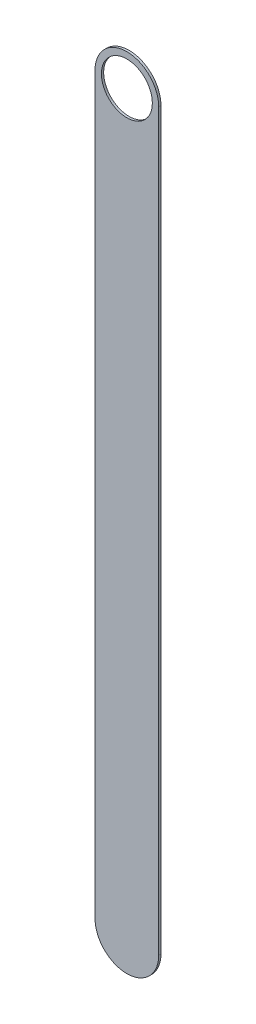
ISO-10303-21;
HEADER;
FILE_DESCRIPTION(('STEP AP214'),'2;1');
FILE_NAME('part.step','',(''),(''),'','','');
FILE_SCHEMA(('AUTOMOTIVE_DESIGN { 1 0 10303 214 1 1 1 1 }'));
ENDSEC;
DATA;
#1=APPLICATION_CONTEXT('core data for automotive mechanical design processes');
#2=APPLICATION_PROTOCOL_DEFINITION('international standard','automotive_design',2000,#1);
#3=PRODUCT_CONTEXT('',#1,'mechanical');
#4=PRODUCT('Part','Part','',(#3));
#5=PRODUCT_RELATED_PRODUCT_CATEGORY('part','',(#4));
#6=PRODUCT_DEFINITION_FORMATION('','',#4);
#7=PRODUCT_DEFINITION_CONTEXT('part definition',#1,'design');
#8=PRODUCT_DEFINITION('design','',#6,#7);
#9=PRODUCT_DEFINITION_SHAPE('','',#8);
#10=(LENGTH_UNIT() NAMED_UNIT(*) SI_UNIT(.MILLI.,.METRE.));
#11=(NAMED_UNIT(*) PLANE_ANGLE_UNIT() SI_UNIT($,.RADIAN.));
#12=(NAMED_UNIT(*) SI_UNIT($,.STERADIAN.) SOLID_ANGLE_UNIT());
#13=UNCERTAINTY_MEASURE_WITH_UNIT(LENGTH_MEASURE(1.E-05),#10,'distance_accuracy_value','');
#14=(GEOMETRIC_REPRESENTATION_CONTEXT(3) GLOBAL_UNCERTAINTY_ASSIGNED_CONTEXT((#13)) GLOBAL_UNIT_ASSIGNED_CONTEXT((#10,
#11,#12)) REPRESENTATION_CONTEXT('',''));
#15=CARTESIAN_POINT('',(0.,0.,0.));
#16=DIRECTION('',(0.,0.,1.));
#17=DIRECTION('',(1.,0.,0.));
#18=AXIS2_PLACEMENT_3D('',#15,#16,#17);
#19=CARTESIAN_POINT('',(57.920001,51.0569972,0.));
#20=DIRECTION('',(-1.,0.,0.));
#21=DIRECTION('',(0.,1.,0.));
#22=AXIS2_PLACEMENT_3D('',#19,#20,#21);
#23=PLANE('',#22);
#24=DIRECTION('',(0.,1.,0.));
#25=VECTOR('',#24,1.);
#26=CARTESIAN_POINT('',(57.920001,51.0569972,0.03556));
#27=LINE('',#26,#25);
#28=CARTESIAN_POINT('',(57.920001,51.0569972,0.03556));
#29=VERTEX_POINT('',#28);
#30=CARTESIAN_POINT('',(57.920001,62.6000272,0.03556));
#31=VERTEX_POINT('',#30);
#32=EDGE_CURVE('E11',#29,#31,#27,.T.);
#33=ORIENTED_EDGE('',*,*,#32,.F.);
#34=DIRECTION('',(0.,0.,1.));
#35=VECTOR('',#34,1.);
#36=CARTESIAN_POINT('',(57.920001,51.0569972,0.));
#37=LINE('',#36,#35);
#38=CARTESIAN_POINT('',(57.920001,51.0569972,0.));
#39=VERTEX_POINT('',#38);
#40=EDGE_CURVE('E24',#39,#29,#37,.T.);
#41=ORIENTED_EDGE('',*,*,#40,.F.);
#42=DIRECTION('',(0.,1.,0.));
#43=VECTOR('',#42,1.);
#44=CARTESIAN_POINT('',(57.920001,51.0569972,0.));
#45=LINE('',#44,#43);
#46=CARTESIAN_POINT('',(57.920001,62.6000272,0.));
#47=VERTEX_POINT('',#46);
#48=EDGE_CURVE('E96',#39,#47,#45,.T.);
#49=ORIENTED_EDGE('',*,*,#48,.T.);
#50=DIRECTION('',(0.,0.,1.));
#51=VECTOR('',#50,1.);
#52=CARTESIAN_POINT('',(57.920001,62.6000272,0.));
#53=LINE('',#52,#51);
#54=EDGE_CURVE('E37',#47,#31,#53,.T.);
#55=ORIENTED_EDGE('',*,*,#54,.T.);
#56=EDGE_LOOP('',(#33,#41,#49,#55));
#57=FACE_BOUND('',#56,.T.);
#58=ADVANCED_FACE('F17',(#57),#23,.F.);
#59=CARTESIAN_POINT('',(57.420002,51.0569972,0.));
#60=DIRECTION('',(0.,0.,-1.));
#61=DIRECTION('',(-1.,0.,0.));
#62=AXIS2_PLACEMENT_3D('',#59,#60,#61);
#63=CYLINDRICAL_SURFACE('',#62,0.499998999999998);
#64=CARTESIAN_POINT('',(57.420002,51.0569972,0.03556));
#65=DIRECTION('',(0.,0.,1.));
#66=DIRECTION('',(-1.,0.,0.));
#67=AXIS2_PLACEMENT_3D('',#64,#65,#66);
#68=CIRCLE('',#67,0.499998999999998);
#69=CARTESIAN_POINT('',(56.920003,51.0569972,0.03556));
#70=VERTEX_POINT('',#69);
#71=EDGE_CURVE('E92',#70,#29,#68,.T.);
#72=ORIENTED_EDGE('',*,*,#71,.F.);
#73=DIRECTION('',(0.,0.,1.));
#74=VECTOR('',#73,1.);
#75=CARTESIAN_POINT('',(56.920003,51.0569972,0.));
#76=LINE('',#75,#74);
#77=CARTESIAN_POINT('',(56.920003,51.0569972,0.));
#78=VERTEX_POINT('',#77);
#79=EDGE_CURVE('E90',#78,#70,#76,.T.);
#80=ORIENTED_EDGE('',*,*,#79,.F.);
#81=CARTESIAN_POINT('',(57.420002,51.0569972,0.));
#82=DIRECTION('',(0.,0.,1.));
#83=DIRECTION('',(-1.,0.,0.));
#84=AXIS2_PLACEMENT_3D('',#81,#82,#83);
#85=CIRCLE('',#84,0.499998999999998);
#86=EDGE_CURVE('E88',#78,#39,#85,.T.);
#87=ORIENTED_EDGE('',*,*,#86,.T.);
#88=ORIENTED_EDGE('',*,*,#40,.T.);
#89=EDGE_LOOP('',(#72,#80,#87,#88));
#90=FACE_BOUND('',#89,.T.);
#91=ADVANCED_FACE('F111',(#90),#63,.T.);
#92=CARTESIAN_POINT('',(57.420002,62.6000272,0.));
#93=DIRECTION('',(0.,0.,-1.));
#94=DIRECTION('',(1.,0.,0.));
#95=AXIS2_PLACEMENT_3D('',#92,#93,#94);
#96=CYLINDRICAL_SURFACE('',#95,0.499998999999998);
#97=CARTESIAN_POINT('',(57.420002,62.6000272,0.03556));
#98=DIRECTION('',(0.,0.,1.));
#99=DIRECTION('',(1.,0.,0.));
#100=AXIS2_PLACEMENT_3D('',#97,#98,#99);
#101=CIRCLE('',#100,0.499998999999998);
#102=CARTESIAN_POINT('',(56.920003,62.6000272,0.03556));
#103=VERTEX_POINT('',#102);
#104=EDGE_CURVE('E85',#31,#103,#101,.T.);
#105=ORIENTED_EDGE('',*,*,#104,.F.);
#106=ORIENTED_EDGE('',*,*,#54,.F.);
#107=CARTESIAN_POINT('',(57.420002,62.6000272,0.));
#108=DIRECTION('',(0.,0.,1.));
#109=DIRECTION('',(1.,0.,0.));
#110=AXIS2_PLACEMENT_3D('',#107,#108,#109);
#111=CIRCLE('',#110,0.499998999999998);
#112=CARTESIAN_POINT('',(56.920003,62.6000272,0.));
#113=VERTEX_POINT('',#112);
#114=EDGE_CURVE('E82',#47,#113,#111,.T.);
#115=ORIENTED_EDGE('',*,*,#114,.T.);
#116=DIRECTION('',(0.,0.,1.));
#117=VECTOR('',#116,1.);
#118=CARTESIAN_POINT('',(56.920003,62.6000272,0.));
#119=LINE('',#118,#117);
#120=EDGE_CURVE('E80',#113,#103,#119,.T.);
#121=ORIENTED_EDGE('',*,*,#120,.T.);
#122=EDGE_LOOP('',(#105,#106,#115,#121));
#123=FACE_BOUND('',#122,.T.);
#124=ADVANCED_FACE('F104',(#123),#96,.T.);
#125=CARTESIAN_POINT('',(56.920003,62.6000272,0.));
#126=DIRECTION('',(1.,0.,0.));
#127=DIRECTION('',(0.,-1.,0.));
#128=AXIS2_PLACEMENT_3D('',#125,#126,#127);
#129=PLANE('',#128);
#130=DIRECTION('',(0.,-1.,0.));
#131=VECTOR('',#130,1.);
#132=CARTESIAN_POINT('',(56.920003,62.6000272,0.03556));
#133=LINE('',#132,#131);
#134=EDGE_CURVE('E77',#103,#70,#133,.T.);
#135=ORIENTED_EDGE('',*,*,#134,.F.);
#136=ORIENTED_EDGE('',*,*,#120,.F.);
#137=DIRECTION('',(0.,-1.,0.));
#138=VECTOR('',#137,1.);
#139=CARTESIAN_POINT('',(56.920003,62.6000272,0.));
#140=LINE('',#139,#138);
#141=EDGE_CURVE('E68',#113,#78,#140,.T.);
#142=ORIENTED_EDGE('',*,*,#141,.T.);
#143=ORIENTED_EDGE('',*,*,#79,.T.);
#144=EDGE_LOOP('',(#135,#136,#142,#143));
#145=FACE_BOUND('',#144,.T.);
#146=ADVANCED_FACE('F110',(#145),#129,.F.);
#147=CARTESIAN_POINT('',(57.420002,62.6000272,0.));
#148=DIRECTION('',(0.,0.,-1.));
#149=DIRECTION('',(1.,0.,0.));
#150=AXIS2_PLACEMENT_3D('',#147,#148,#149);
#151=CYLINDRICAL_SURFACE('',#150,0.3999992);
#152=DIRECTION('',(0.,0.,1.));
#153=VECTOR('',#152,1.);
#154=CARTESIAN_POINT('',(57.8200012,62.6000272,0.));
#155=LINE('',#154,#153);
#156=CARTESIAN_POINT('',(57.8200012,62.6000272,0.));
#157=VERTEX_POINT('',#156);
#158=CARTESIAN_POINT('',(57.8200012,62.6000272,0.03556));
#159=VERTEX_POINT('',#158);
#160=EDGE_CURVE('E62',#157,#159,#155,.T.);
#161=ORIENTED_EDGE('',*,*,#160,.T.);
#162=CARTESIAN_POINT('',(57.420002,62.6000272,0.03556));
#163=DIRECTION('',(0.,0.,1.));
#164=DIRECTION('',(1.,0.,0.));
#165=AXIS2_PLACEMENT_3D('',#162,#163,#164);
#166=CIRCLE('',#165,0.3999992);
#167=EDGE_CURVE('E67',#159,#159,#166,.T.);
#168=ORIENTED_EDGE('',*,*,#167,.T.);
#169=ORIENTED_EDGE('',*,*,#160,.F.);
#170=CARTESIAN_POINT('',(57.420002,62.6000272,0.));
#171=DIRECTION('',(0.,0.,1.));
#172=DIRECTION('',(1.,0.,0.));
#173=AXIS2_PLACEMENT_3D('',#170,#171,#172);
#174=CIRCLE('',#173,0.3999992);
#175=EDGE_CURVE('E65',#157,#157,#174,.T.);
#176=ORIENTED_EDGE('',*,*,#175,.F.);
#177=EDGE_LOOP('',(#161,#168,#169,#176));
#178=FACE_BOUND('',#177,.T.);
#179=ADVANCED_FACE('F64',(#178),#151,.F.);
#180=CARTESIAN_POINT('',(57.920001,51.0569972,0.));
#181=DIRECTION('',(0.,0.,-1.));
#182=DIRECTION('',(-1.,0.,0.));
#183=AXIS2_PLACEMENT_3D('',#180,#181,#182);
#184=PLANE('',#183);
#185=ORIENTED_EDGE('',*,*,#48,.F.);
#186=ORIENTED_EDGE('',*,*,#86,.F.);
#187=ORIENTED_EDGE('',*,*,#141,.F.);
#188=ORIENTED_EDGE('',*,*,#114,.F.);
#189=EDGE_LOOP('',(#185,#186,#187,#188));
#190=FACE_BOUND('',#189,.T.);
#191=ORIENTED_EDGE('',*,*,#175,.T.);
#192=EDGE_LOOP('',(#191));
#193=FACE_BOUND('',#192,.T.);
#194=ADVANCED_FACE('F71',(#190,#193),#184,.T.);
#195=CARTESIAN_POINT('',(57.920001,51.0569972,0.03556));
#196=DIRECTION('',(0.,0.,-1.));
#197=DIRECTION('',(-1.,0.,0.));
#198=AXIS2_PLACEMENT_3D('',#195,#196,#197);
#199=PLANE('',#198);
#200=ORIENTED_EDGE('',*,*,#134,.T.);
#201=ORIENTED_EDGE('',*,*,#71,.T.);
#202=ORIENTED_EDGE('',*,*,#32,.T.);
#203=ORIENTED_EDGE('',*,*,#104,.T.);
#204=EDGE_LOOP('',(#200,#201,#202,#203));
#205=FACE_BOUND('',#204,.T.);
#206=ORIENTED_EDGE('',*,*,#167,.F.);
#207=EDGE_LOOP('',(#206));
#208=FACE_BOUND('',#207,.T.);
#209=ADVANCED_FACE('F107',(#205,#208),#199,.F.);
#210=CLOSED_SHELL('',(#58,#91,#124,#146,#179,#194,#209));
#211=MANIFOLD_SOLID_BREP('B1',#210);
#212=ADVANCED_BREP_SHAPE_REPRESENTATION('',(#18,#211),#14);
#213=SHAPE_DEFINITION_REPRESENTATION(#9,#212);
ENDSEC;
END-ISO-10303-21;
